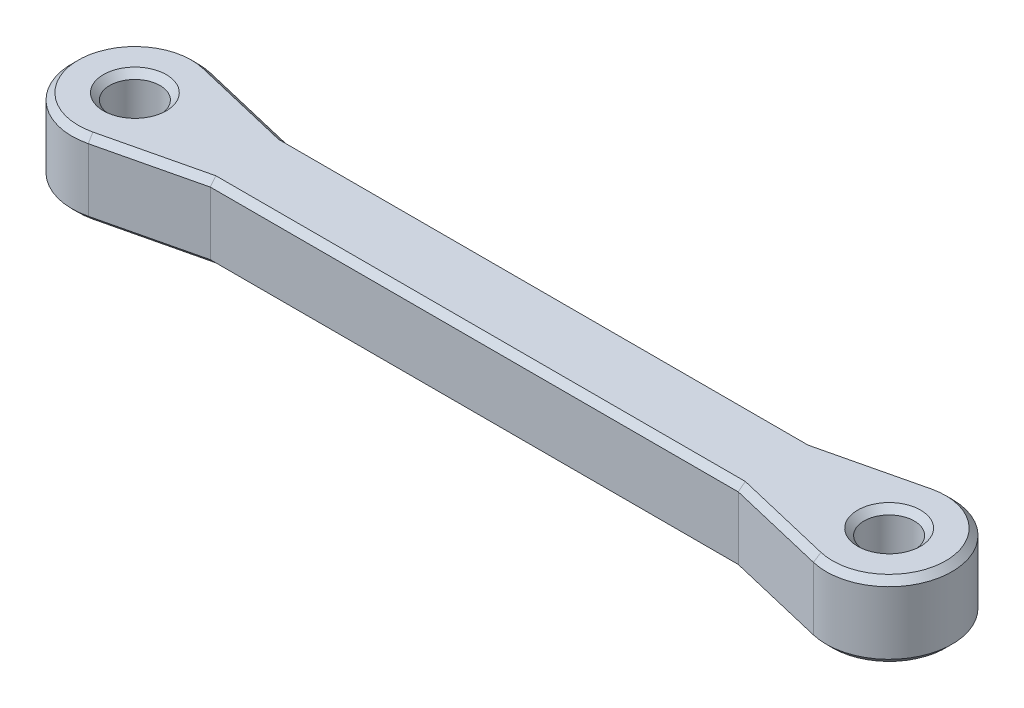
ISO-10303-21;
HEADER;
FILE_DESCRIPTION(('STEP AP214'),'2;1');
FILE_NAME('part.step','',(''),(''),'','','');
FILE_SCHEMA(('AUTOMOTIVE_DESIGN { 1 0 10303 214 1 1 1 1 }'));
ENDSEC;
DATA;
#1=APPLICATION_CONTEXT('core data for automotive mechanical design processes');
#2=APPLICATION_PROTOCOL_DEFINITION('international standard','automotive_design',2000,#1);
#3=PRODUCT_CONTEXT('',#1,'mechanical');
#4=PRODUCT('Part','Part','',(#3));
#5=PRODUCT_RELATED_PRODUCT_CATEGORY('part','',(#4));
#6=PRODUCT_DEFINITION_FORMATION('','',#4);
#7=PRODUCT_DEFINITION_CONTEXT('part definition',#1,'design');
#8=PRODUCT_DEFINITION('design','',#6,#7);
#9=PRODUCT_DEFINITION_SHAPE('','',#8);
#10=(LENGTH_UNIT() NAMED_UNIT(*) SI_UNIT(.MILLI.,.METRE.));
#11=(NAMED_UNIT(*) PLANE_ANGLE_UNIT() SI_UNIT($,.RADIAN.));
#12=(NAMED_UNIT(*) SI_UNIT($,.STERADIAN.) SOLID_ANGLE_UNIT());
#13=UNCERTAINTY_MEASURE_WITH_UNIT(LENGTH_MEASURE(1.E-05),#10,'distance_accuracy_value','');
#14=(GEOMETRIC_REPRESENTATION_CONTEXT(3) GLOBAL_UNCERTAINTY_ASSIGNED_CONTEXT((#13)) GLOBAL_UNIT_ASSIGNED_CONTEXT((#10,
#11,#12)) REPRESENTATION_CONTEXT('',''));
#15=CARTESIAN_POINT('',(0.,0.,0.));
#16=DIRECTION('',(0.,0.,1.));
#17=DIRECTION('',(1.,0.,0.));
#18=AXIS2_PLACEMENT_3D('',#15,#16,#17);
#19=CARTESIAN_POINT('',(2.,3.,-1.5));
#20=DIRECTION('',(0.,0.,1.));
#21=DIRECTION('',(1.,0.,0.));
#22=AXIS2_PLACEMENT_3D('',#19,#20,#21);
#23=PLANE('',#22);
#24=DIRECTION('',(0.,-1.,0.));
#25=VECTOR('',#24,1.);
#26=CARTESIAN_POINT('',(25.5,7.03112887414928,-1.50000000000001));
#27=LINE('',#26,#25);
#28=CARTESIAN_POINT('',(25.5,2.75,-1.50000000000001));
#29=VERTEX_POINT('',#28);
#30=CARTESIAN_POINT('',(25.5,0.25,-1.50000000000001));
#31=VERTEX_POINT('',#30);
#32=EDGE_CURVE('E351',#29,#31,#27,.T.);
#33=ORIENTED_EDGE('',*,*,#32,.T.);
#34=DIRECTION('',(-1.,0.,0.));
#35=VECTOR('',#34,1.);
#36=CARTESIAN_POINT('',(2.,0.25,-1.5));
#37=LINE('',#36,#35);
#38=CARTESIAN_POINT('',(4.5,0.25,-1.5));
#39=VERTEX_POINT('',#38);
#40=EDGE_CURVE('E167',#31,#39,#37,.T.);
#41=ORIENTED_EDGE('',*,*,#40,.T.);
#42=DIRECTION('',(0.,-1.,0.));
#43=VECTOR('',#42,1.);
#44=CARTESIAN_POINT('',(4.5,7.03112887414928,-1.5));
#45=LINE('',#44,#43);
#46=CARTESIAN_POINT('',(4.5,2.75,-1.5));
#47=VERTEX_POINT('',#46);
#48=EDGE_CURVE('E310',#47,#39,#45,.T.);
#49=ORIENTED_EDGE('',*,*,#48,.F.);
#50=DIRECTION('',(1.,0.,0.));
#51=VECTOR('',#50,1.);
#52=CARTESIAN_POINT('',(25.5,2.75,-1.5));
#53=LINE('',#52,#51);
#54=EDGE_CURVE('E209',#47,#29,#53,.T.);
#55=ORIENTED_EDGE('',*,*,#54,.T.);
#56=EDGE_LOOP('',(#33,#41,#49,#55));
#57=FACE_BOUND('',#56,.T.);
#58=ADVANCED_FACE('F43',(#57),#23,.F.);
#59=CARTESIAN_POINT('',(30.,3.,0.));
#60=DIRECTION('',(0.,-1.,0.));
#61=DIRECTION('',(0.,0.,-1.));
#62=AXIS2_PLACEMENT_3D('',#59,#60,#61);
#63=CYLINDRICAL_SURFACE('',#62,2.5);
#64=DIRECTION('',(0.,-1.,0.));
#65=VECTOR('',#64,1.);
#66=CARTESIAN_POINT('',(29.4218548123582,7.03112887414928,2.43223110374131));
#67=LINE('',#66,#65);
#68=CARTESIAN_POINT('',(29.4218548123582,2.75,2.43223110374131));
#69=VERTEX_POINT('',#68);
#70=CARTESIAN_POINT('',(29.4218548123582,0.25,2.43223110374131));
#71=VERTEX_POINT('',#70);
#72=EDGE_CURVE('E347',#69,#71,#67,.T.);
#73=ORIENTED_EDGE('',*,*,#72,.T.);
#74=CARTESIAN_POINT('',(30.,0.25,0.));
#75=DIRECTION('',(0.,1.,0.));
#76=DIRECTION('',(0.,0.,1.));
#77=AXIS2_PLACEMENT_3D('',#74,#75,#76);
#78=CIRCLE('',#77,2.5);
#79=CARTESIAN_POINT('',(29.4218548123582,0.25,-2.43223110374131));
#80=VERTEX_POINT('',#79);
#81=EDGE_CURVE('E235',#71,#80,#78,.T.);
#82=ORIENTED_EDGE('',*,*,#81,.T.);
#83=DIRECTION('',(0.,-1.,0.));
#84=VECTOR('',#83,1.);
#85=CARTESIAN_POINT('',(29.4218548123582,7.03112887414928,-2.43223110374131));
#86=LINE('',#85,#84);
#87=CARTESIAN_POINT('',(29.4218548123582,2.75,-2.43223110374131));
#88=VERTEX_POINT('',#87);
#89=EDGE_CURVE('E273',#88,#80,#86,.T.);
#90=ORIENTED_EDGE('',*,*,#89,.F.);
#91=CARTESIAN_POINT('',(30.,2.75,0.));
#92=DIRECTION('',(0.,1.,0.));
#93=DIRECTION('',(0.,0.,1.));
#94=AXIS2_PLACEMENT_3D('',#91,#92,#93);
#95=CIRCLE('',#94,2.5);
#96=EDGE_CURVE('E233',#88,#69,#95,.F.);
#97=ORIENTED_EDGE('',*,*,#96,.T.);
#98=EDGE_LOOP('',(#73,#82,#90,#97));
#99=FACE_BOUND('',#98,.T.);
#100=ADVANCED_FACE('F414',(#99),#63,.T.);
#101=CARTESIAN_POINT('',(28.,3.,1.5));
#102=DIRECTION('',(0.,0.,-1.));
#103=DIRECTION('',(-1.,0.,0.));
#104=AXIS2_PLACEMENT_3D('',#101,#102,#103);
#105=PLANE('',#104);
#106=DIRECTION('',(0.,-1.,0.));
#107=VECTOR('',#106,1.);
#108=CARTESIAN_POINT('',(4.5,7.03112887414928,1.5));
#109=LINE('',#108,#107);
#110=CARTESIAN_POINT('',(4.5,2.75,1.5));
#111=VERTEX_POINT('',#110);
#112=CARTESIAN_POINT('',(4.5,0.25,1.5));
#113=VERTEX_POINT('',#112);
#114=EDGE_CURVE('E315',#111,#113,#109,.T.);
#115=ORIENTED_EDGE('',*,*,#114,.T.);
#116=DIRECTION('',(1.,0.,0.));
#117=VECTOR('',#116,1.);
#118=CARTESIAN_POINT('',(28.,0.25,1.5));
#119=LINE('',#118,#117);
#120=CARTESIAN_POINT('',(25.5,0.25,1.5));
#121=VERTEX_POINT('',#120);
#122=EDGE_CURVE('E226',#113,#121,#119,.T.);
#123=ORIENTED_EDGE('',*,*,#122,.T.);
#124=DIRECTION('',(0.,-1.,0.));
#125=VECTOR('',#124,1.);
#126=CARTESIAN_POINT('',(25.5,7.03112887414928,1.5));
#127=LINE('',#126,#125);
#128=CARTESIAN_POINT('',(25.5,2.75,1.5));
#129=VERTEX_POINT('',#128);
#130=EDGE_CURVE('E345',#129,#121,#127,.T.);
#131=ORIENTED_EDGE('',*,*,#130,.F.);
#132=DIRECTION('',(-1.,0.,0.));
#133=VECTOR('',#132,1.);
#134=CARTESIAN_POINT('',(4.5,2.75,1.5));
#135=LINE('',#134,#133);
#136=EDGE_CURVE('E224',#129,#111,#135,.T.);
#137=ORIENTED_EDGE('',*,*,#136,.T.);
#138=EDGE_LOOP('',(#115,#123,#131,#137));
#139=FACE_BOUND('',#138,.T.);
#140=ADVANCED_FACE('F381',(#139),#105,.F.);
#141=CARTESIAN_POINT('',(0.,3.,0.));
#142=DIRECTION('',(0.,-1.,0.));
#143=DIRECTION('',(0.,0.,-1.));
#144=AXIS2_PLACEMENT_3D('',#141,#142,#143);
#145=CYLINDRICAL_SURFACE('',#144,2.5);
#146=DIRECTION('',(0.,-1.,0.));
#147=VECTOR('',#146,1.);
#148=CARTESIAN_POINT('',(0.578145187641785,7.03112887414928,-2.4322311037413));
#149=LINE('',#148,#147);
#150=CARTESIAN_POINT('',(0.578145187641785,2.75,-2.4322311037413));
#151=VERTEX_POINT('',#150);
#152=CARTESIAN_POINT('',(0.578145187641785,0.25,-2.4322311037413));
#153=VERTEX_POINT('',#152);
#154=EDGE_CURVE('E181',#151,#153,#149,.T.);
#155=ORIENTED_EDGE('',*,*,#154,.T.);
#156=CARTESIAN_POINT('',(0.,0.25,0.));
#157=DIRECTION('',(0.,1.,0.));
#158=DIRECTION('',(0.,0.,1.));
#159=AXIS2_PLACEMENT_3D('',#156,#157,#158);
#160=CIRCLE('',#159,2.5);
#161=CARTESIAN_POINT('',(0.578145187641785,0.25,2.4322311037413));
#162=VERTEX_POINT('',#161);
#163=EDGE_CURVE('E218',#153,#162,#160,.T.);
#164=ORIENTED_EDGE('',*,*,#163,.T.);
#165=DIRECTION('',(0.,-1.,0.));
#166=VECTOR('',#165,1.);
#167=CARTESIAN_POINT('',(0.578145187641785,7.03112887414928,2.4322311037413));
#168=LINE('',#167,#166);
#169=CARTESIAN_POINT('',(0.578145187641785,2.75,2.4322311037413));
#170=VERTEX_POINT('',#169);
#171=EDGE_CURVE('E319',#170,#162,#168,.T.);
#172=ORIENTED_EDGE('',*,*,#171,.F.);
#173=CARTESIAN_POINT('',(0.,2.75,0.));
#174=DIRECTION('',(0.,1.,0.));
#175=DIRECTION('',(0.,0.,1.));
#176=AXIS2_PLACEMENT_3D('',#173,#174,#175);
#177=CIRCLE('',#176,2.5);
#178=EDGE_CURVE('E216',#170,#151,#177,.F.);
#179=ORIENTED_EDGE('',*,*,#178,.T.);
#180=EDGE_LOOP('',(#155,#164,#172,#179));
#181=FACE_BOUND('',#180,.T.);
#182=ADVANCED_FACE('F340',(#181),#145,.T.);
#183=CARTESIAN_POINT('',(0.,3.,0.));
#184=DIRECTION('',(0.,1.,0.));
#185=DIRECTION('',(0.,0.,1.));
#186=AXIS2_PLACEMENT_3D('',#183,#184,#185);
#187=PLANE('',#186);
#188=CARTESIAN_POINT('',(30.,3.,0.));
#189=DIRECTION('',(0.,1.,0.));
#190=DIRECTION('',(0.,0.,1.));
#191=AXIS2_PLACEMENT_3D('',#188,#189,#190);
#192=CIRCLE('',#191,1.25000000000001);
#193=CARTESIAN_POINT('',(30.,3.,1.25000000000001));
#194=VERTEX_POINT('',#193);
#195=EDGE_CURVE('E11',#194,#194,#192,.F.);
#196=ORIENTED_EDGE('',*,*,#195,.T.);
#197=EDGE_LOOP('',(#196));
#198=FACE_BOUND('',#197,.T.);
#199=CARTESIAN_POINT('',(0.,3.,0.));
#200=DIRECTION('',(0.,1.,0.));
#201=DIRECTION('',(0.,0.,1.));
#202=AXIS2_PLACEMENT_3D('',#199,#200,#201);
#203=CIRCLE('',#202,1.25000000000001);
#204=CARTESIAN_POINT('',(0.,3.,1.25000000000001));
#205=VERTEX_POINT('',#204);
#206=EDGE_CURVE('E53',#205,#205,#203,.F.);
#207=ORIENTED_EDGE('',*,*,#206,.T.);
#208=EDGE_LOOP('',(#207));
#209=FACE_BOUND('',#208,.T.);
#210=DIRECTION('',(1.,0.,0.));
#211=VECTOR('',#210,1.);
#212=CARTESIAN_POINT('',(25.5,3.,1.25));
#213=LINE('',#212,#211);
#214=CARTESIAN_POINT('',(4.47069555463433,3.,1.25));
#215=VERTEX_POINT('',#214);
#216=CARTESIAN_POINT('',(25.5293044453657,3.,1.25));
#217=VERTEX_POINT('',#216);
#218=EDGE_CURVE('E61',#215,#217,#213,.T.);
#219=ORIENTED_EDGE('',*,*,#218,.T.);
#220=DIRECTION('',(0.972892441496522,0.,0.231258075056715));
#221=VECTOR('',#220,1.);
#222=CARTESIAN_POINT('',(29.4796693311224,3.,2.18900799336718));
#223=LINE('',#222,#221);
#224=CARTESIAN_POINT('',(29.4796693311224,3.,2.18900799336717));
#225=VERTEX_POINT('',#224);
#226=EDGE_CURVE('E253',#217,#225,#223,.T.);
#227=ORIENTED_EDGE('',*,*,#226,.T.);
#228=CARTESIAN_POINT('',(30.,3.,0.));
#229=DIRECTION('',(0.,1.,0.));
#230=DIRECTION('',(0.,0.,1.));
#231=AXIS2_PLACEMENT_3D('',#228,#229,#230);
#232=CIRCLE('',#231,2.25);
#233=CARTESIAN_POINT('',(29.4796693311224,3.,-2.18900799336717));
#234=VERTEX_POINT('',#233);
#235=EDGE_CURVE('E241',#225,#234,#232,.T.);
#236=ORIENTED_EDGE('',*,*,#235,.T.);
#237=DIRECTION('',(-0.972892441496522,0.,0.231258075056714));
#238=VECTOR('',#237,1.);
#239=CARTESIAN_POINT('',(25.5578145187642,3.,-1.25677688962588));
#240=LINE('',#239,#238);
#241=CARTESIAN_POINT('',(25.5293044453656,3.,-1.25));
#242=VERTEX_POINT('',#241);
#243=EDGE_CURVE('E243',#234,#242,#240,.T.);
#244=ORIENTED_EDGE('',*,*,#243,.T.);
#245=DIRECTION('',(-1.,0.,0.));
#246=VECTOR('',#245,1.);
#247=CARTESIAN_POINT('',(4.5,3.,-1.25));
#248=LINE('',#247,#246);
#249=CARTESIAN_POINT('',(4.47069555463433,3.,-1.25));
#250=VERTEX_POINT('',#249);
#251=EDGE_CURVE('E245',#242,#250,#248,.T.);
#252=ORIENTED_EDGE('',*,*,#251,.T.);
#253=DIRECTION('',(-0.972892441496522,0.,-0.231258075056714));
#254=VECTOR('',#253,1.);
#255=CARTESIAN_POINT('',(0.520330668877606,3.,-2.18900799336717));
#256=LINE('',#255,#254);
#257=CARTESIAN_POINT('',(0.520330668877606,3.,-2.18900799336717));
#258=VERTEX_POINT('',#257);
#259=EDGE_CURVE('E247',#250,#258,#256,.T.);
#260=ORIENTED_EDGE('',*,*,#259,.T.);
#261=CARTESIAN_POINT('',(0.,3.,0.));
#262=DIRECTION('',(0.,1.,0.));
#263=DIRECTION('',(0.,0.,1.));
#264=AXIS2_PLACEMENT_3D('',#261,#262,#263);
#265=CIRCLE('',#264,2.25);
#266=CARTESIAN_POINT('',(0.520330668877607,3.,2.18900799336717));
#267=VERTEX_POINT('',#266);
#268=EDGE_CURVE('E249',#258,#267,#265,.T.);
#269=ORIENTED_EDGE('',*,*,#268,.T.);
#270=DIRECTION('',(0.972892441496522,0.,-0.231258075056714));
#271=VECTOR('',#270,1.);
#272=CARTESIAN_POINT('',(4.44218548123582,3.,1.25677688962587));
#273=LINE('',#272,#271);
#274=EDGE_CURVE('E66',#267,#215,#273,.T.);
#275=ORIENTED_EDGE('',*,*,#274,.T.);
#276=EDGE_LOOP('',(#219,#227,#236,#244,#252,#260,#269,#275));
#277=FACE_BOUND('',#276,.T.);
#278=ADVANCED_FACE('F399',(#198,#209,#277),#187,.T.);
#279=CARTESIAN_POINT('',(0.,0.,0.));
#280=DIRECTION('',(0.,1.,0.));
#281=DIRECTION('',(0.,0.,1.));
#282=AXIS2_PLACEMENT_3D('',#279,#280,#281);
#283=PLANE('',#282);
#284=CARTESIAN_POINT('',(30.,0.,0.));
#285=DIRECTION('',(0.,1.,0.));
#286=DIRECTION('',(0.,0.,1.));
#287=AXIS2_PLACEMENT_3D('',#284,#285,#286);
#288=CIRCLE('',#287,1.25);
#289=CARTESIAN_POINT('',(30.,0.,1.25));
#290=VERTEX_POINT('',#289);
#291=EDGE_CURVE('E189',#290,#290,#288,.T.);
#292=ORIENTED_EDGE('',*,*,#291,.T.);
#293=EDGE_LOOP('',(#292));
#294=FACE_BOUND('',#293,.T.);
#295=CARTESIAN_POINT('',(0.,0.,0.));
#296=DIRECTION('',(0.,1.,0.));
#297=DIRECTION('',(0.,0.,1.));
#298=AXIS2_PLACEMENT_3D('',#295,#296,#297);
#299=CIRCLE('',#298,1.25);
#300=CARTESIAN_POINT('',(0.,0.,1.25));
#301=VERTEX_POINT('',#300);
#302=EDGE_CURVE('E186',#301,#301,#299,.T.);
#303=ORIENTED_EDGE('',*,*,#302,.T.);
#304=EDGE_LOOP('',(#303));
#305=FACE_BOUND('',#304,.T.);
#306=DIRECTION('',(0.972892441496522,0.,0.231258075056714));
#307=VECTOR('',#306,1.);
#308=CARTESIAN_POINT('',(0.520330668877606,0.,-2.18900799336717));
#309=LINE('',#308,#307);
#310=CARTESIAN_POINT('',(0.520330668877607,0.,-2.18900799336717));
#311=VERTEX_POINT('',#310);
#312=CARTESIAN_POINT('',(4.47069555463433,0.,-1.25));
#313=VERTEX_POINT('',#312);
#314=EDGE_CURVE('E185',#311,#313,#309,.T.);
#315=ORIENTED_EDGE('',*,*,#314,.T.);
#316=DIRECTION('',(1.,0.,0.));
#317=VECTOR('',#316,1.);
#318=CARTESIAN_POINT('',(0.,0.,-1.25));
#319=LINE('',#318,#317);
#320=CARTESIAN_POINT('',(25.5293044453656,0.,-1.25));
#321=VERTEX_POINT('',#320);
#322=EDGE_CURVE('E164',#313,#321,#319,.T.);
#323=ORIENTED_EDGE('',*,*,#322,.T.);
#324=DIRECTION('',(0.972892441496522,0.,-0.231258075056714));
#325=VECTOR('',#324,1.);
#326=CARTESIAN_POINT('',(1.08407824949049,0.,4.56066900436418));
#327=LINE('',#326,#325);
#328=CARTESIAN_POINT('',(29.4796693311224,0.,-2.18900799336718));
#329=VERTEX_POINT('',#328);
#330=EDGE_CURVE('E174',#321,#329,#327,.T.);
#331=ORIENTED_EDGE('',*,*,#330,.T.);
#332=CARTESIAN_POINT('',(30.,0.,0.));
#333=DIRECTION('',(0.,1.,0.));
#334=DIRECTION('',(0.,0.,1.));
#335=AXIS2_PLACEMENT_3D('',#332,#333,#334);
#336=CIRCLE('',#335,2.25);
#337=CARTESIAN_POINT('',(29.4796693311224,0.,2.18900799336718));
#338=VERTEX_POINT('',#337);
#339=EDGE_CURVE('E180',#329,#338,#336,.F.);
#340=ORIENTED_EDGE('',*,*,#339,.T.);
#341=DIRECTION('',(-0.972892441496522,0.,-0.231258075056715));
#342=VECTOR('',#341,1.);
#343=CARTESIAN_POINT('',(1.08407824949051,0.,-4.56066900436422));
#344=LINE('',#343,#342);
#345=CARTESIAN_POINT('',(25.5293044453657,0.,1.25));
#346=VERTEX_POINT('',#345);
#347=EDGE_CURVE('E324',#338,#346,#344,.T.);
#348=ORIENTED_EDGE('',*,*,#347,.T.);
#349=DIRECTION('',(-1.,0.,0.));
#350=VECTOR('',#349,1.);
#351=CARTESIAN_POINT('',(0.,0.,1.25));
#352=LINE('',#351,#350);
#353=CARTESIAN_POINT('',(4.47069555463433,0.,1.25));
#354=VERTEX_POINT('',#353);
#355=EDGE_CURVE('E326',#346,#354,#352,.T.);
#356=ORIENTED_EDGE('',*,*,#355,.T.);
#357=DIRECTION('',(-0.972892441496522,0.,0.231258075056714));
#358=VECTOR('',#357,1.);
#359=CARTESIAN_POINT('',(0.520330668877607,0.,2.18900799336717));
#360=LINE('',#359,#358);
#361=CARTESIAN_POINT('',(0.520330668877607,0.,2.18900799336717));
#362=VERTEX_POINT('',#361);
#363=EDGE_CURVE('E328',#354,#362,#360,.T.);
#364=ORIENTED_EDGE('',*,*,#363,.T.);
#365=CARTESIAN_POINT('',(0.,0.,0.));
#366=DIRECTION('',(0.,1.,0.));
#367=DIRECTION('',(0.,0.,1.));
#368=AXIS2_PLACEMENT_3D('',#365,#366,#367);
#369=CIRCLE('',#368,2.25);
#370=EDGE_CURVE('E191',#362,#311,#369,.F.);
#371=ORIENTED_EDGE('',*,*,#370,.T.);
#372=EDGE_LOOP('',(#315,#323,#331,#340,#348,#356,#364,#371));
#373=FACE_BOUND('',#372,.T.);
#374=ADVANCED_FACE('F183',(#294,#305,#373),#283,.F.);
#375=CARTESIAN_POINT('',(30.,5.82842712474619,0.));
#376=DIRECTION('',(0.,-1.,0.));
#377=DIRECTION('',(0.,0.,-1.));
#378=AXIS2_PLACEMENT_3D('',#375,#376,#377);
#379=CYLINDRICAL_SURFACE('',#378,1.);
#380=CARTESIAN_POINT('',(30.,0.250000000000003,0.));
#381=DIRECTION('',(0.,1.,0.));
#382=DIRECTION('',(0.,0.,1.));
#383=AXIS2_PLACEMENT_3D('',#380,#381,#382);
#384=CIRCLE('',#383,1.);
#385=CARTESIAN_POINT('',(30.,0.250000000000003,1.));
#386=VERTEX_POINT('',#385);
#387=EDGE_CURVE('E200',#386,#386,#384,.F.);
#388=ORIENTED_EDGE('',*,*,#387,.T.);
#389=EDGE_LOOP('',(#388));
#390=FACE_BOUND('',#389,.T.);
#391=CARTESIAN_POINT('',(30.,2.74999999999999,0.));
#392=DIRECTION('',(0.,1.,0.));
#393=DIRECTION('',(0.,0.,1.));
#394=AXIS2_PLACEMENT_3D('',#391,#392,#393);
#395=CIRCLE('',#394,1.);
#396=CARTESIAN_POINT('',(30.,2.74999999999999,1.));
#397=VERTEX_POINT('',#396);
#398=EDGE_CURVE('E197',#397,#397,#395,.T.);
#399=ORIENTED_EDGE('',*,*,#398,.T.);
#400=EDGE_LOOP('',(#399));
#401=FACE_BOUND('',#400,.T.);
#402=ADVANCED_FACE('F407',(#390,#401),#379,.F.);
#403=CARTESIAN_POINT('',(0.,5.82842712474619,0.));
#404=DIRECTION('',(0.,-1.,0.));
#405=DIRECTION('',(0.,0.,-1.));
#406=AXIS2_PLACEMENT_3D('',#403,#404,#405);
#407=CYLINDRICAL_SURFACE('',#406,1.);
#408=CARTESIAN_POINT('',(0.,0.250000000000005,0.));
#409=DIRECTION('',(0.,1.,0.));
#410=DIRECTION('',(0.,0.,1.));
#411=AXIS2_PLACEMENT_3D('',#408,#409,#410);
#412=CIRCLE('',#411,1.);
#413=CARTESIAN_POINT('',(0.,0.250000000000005,1.));
#414=VERTEX_POINT('',#413);
#415=EDGE_CURVE('E206',#414,#414,#412,.F.);
#416=ORIENTED_EDGE('',*,*,#415,.T.);
#417=EDGE_LOOP('',(#416));
#418=FACE_BOUND('',#417,.T.);
#419=CARTESIAN_POINT('',(0.,2.74999999999999,0.));
#420=DIRECTION('',(0.,1.,0.));
#421=DIRECTION('',(0.,0.,1.));
#422=AXIS2_PLACEMENT_3D('',#419,#420,#421);
#423=CIRCLE('',#422,1.);
#424=CARTESIAN_POINT('',(0.,2.74999999999999,1.));
#425=VERTEX_POINT('',#424);
#426=EDGE_CURVE('E203',#425,#425,#423,.T.);
#427=ORIENTED_EDGE('',*,*,#426,.T.);
#428=EDGE_LOOP('',(#427));
#429=FACE_BOUND('',#428,.T.);
#430=ADVANCED_FACE('F606',(#418,#429),#407,.F.);
#431=CARTESIAN_POINT('',(4.5,7.03112887414928,-1.5));
#432=DIRECTION('',(-0.231258075056714,0.,0.972892441496522));
#433=DIRECTION('',(0.972892441496522,0.,0.231258075056714));
#434=AXIS2_PLACEMENT_3D('',#431,#432,#433);
#435=PLANE('',#434);
#436=ORIENTED_EDGE('',*,*,#48,.T.);
#437=DIRECTION('',(-0.972892441496522,0.,-0.231258075056714));
#438=VECTOR('',#437,1.);
#439=CARTESIAN_POINT('',(4.5,0.25,-1.5));
#440=LINE('',#439,#438);
#441=EDGE_CURVE('E214',#39,#153,#440,.T.);
#442=ORIENTED_EDGE('',*,*,#441,.T.);
#443=ORIENTED_EDGE('',*,*,#154,.F.);
#444=DIRECTION('',(0.972892441496522,0.,0.231258075056714));
#445=VECTOR('',#444,1.);
#446=CARTESIAN_POINT('',(4.5,2.75,-1.5));
#447=LINE('',#446,#445);
#448=EDGE_CURVE('E212',#151,#47,#447,.T.);
#449=ORIENTED_EDGE('',*,*,#448,.T.);
#450=EDGE_LOOP('',(#436,#442,#443,#449));
#451=FACE_BOUND('',#450,.T.);
#452=ADVANCED_FACE('F309',(#451),#435,.F.);
#453=CARTESIAN_POINT('',(4.5,7.03112887414928,1.5));
#454=DIRECTION('',(-0.231258075056714,0.,-0.972892441496522));
#455=DIRECTION('',(-0.972892441496522,0.,0.231258075056714));
#456=AXIS2_PLACEMENT_3D('',#453,#454,#455);
#457=PLANE('',#456);
#458=ORIENTED_EDGE('',*,*,#171,.T.);
#459=DIRECTION('',(0.972892441496522,0.,-0.231258075056714));
#460=VECTOR('',#459,1.);
#461=CARTESIAN_POINT('',(4.5,0.25,1.5));
#462=LINE('',#461,#460);
#463=EDGE_CURVE('E222',#162,#113,#462,.T.);
#464=ORIENTED_EDGE('',*,*,#463,.T.);
#465=ORIENTED_EDGE('',*,*,#114,.F.);
#466=DIRECTION('',(-0.972892441496522,0.,0.231258075056714));
#467=VECTOR('',#466,1.);
#468=CARTESIAN_POINT('',(0.578145187641785,2.75,2.4322311037413));
#469=LINE('',#468,#467);
#470=EDGE_CURVE('E220',#111,#170,#469,.T.);
#471=ORIENTED_EDGE('',*,*,#470,.T.);
#472=EDGE_LOOP('',(#458,#464,#465,#471));
#473=FACE_BOUND('',#472,.T.);
#474=ADVANCED_FACE('F378',(#473),#457,.F.);
#475=CARTESIAN_POINT('',(25.5,7.03112887414928,1.5));
#476=DIRECTION('',(0.231258075056715,0.,-0.972892441496522));
#477=DIRECTION('',(-0.972892441496522,0.,-0.231258075056715));
#478=AXIS2_PLACEMENT_3D('',#475,#476,#477);
#479=PLANE('',#478);
#480=ORIENTED_EDGE('',*,*,#130,.T.);
#481=DIRECTION('',(0.972892441496522,0.,0.231258075056715));
#482=VECTOR('',#481,1.);
#483=CARTESIAN_POINT('',(25.5,0.25,1.5));
#484=LINE('',#483,#482);
#485=EDGE_CURVE('E231',#121,#71,#484,.T.);
#486=ORIENTED_EDGE('',*,*,#485,.T.);
#487=ORIENTED_EDGE('',*,*,#72,.F.);
#488=DIRECTION('',(-0.972892441496522,0.,-0.231258075056715));
#489=VECTOR('',#488,1.);
#490=CARTESIAN_POINT('',(25.5,2.75,1.50000000000001));
#491=LINE('',#490,#489);
#492=EDGE_CURVE('E228',#69,#129,#491,.T.);
#493=ORIENTED_EDGE('',*,*,#492,.T.);
#494=EDGE_LOOP('',(#480,#486,#487,#493));
#495=FACE_BOUND('',#494,.T.);
#496=ADVANCED_FACE('F390',(#495),#479,.F.);
#497=CARTESIAN_POINT('',(25.5,7.03112887414928,-1.50000000000001));
#498=DIRECTION('',(0.231258075056714,0.,0.972892441496522));
#499=DIRECTION('',(0.972892441496522,0.,-0.231258075056714));
#500=AXIS2_PLACEMENT_3D('',#497,#498,#499);
#501=PLANE('',#500);
#502=ORIENTED_EDGE('',*,*,#89,.T.);
#503=DIRECTION('',(-0.972892441496522,0.,0.231258075056714));
#504=VECTOR('',#503,1.);
#505=CARTESIAN_POINT('',(25.5,0.25,-1.50000000000001));
#506=LINE('',#505,#504);
#507=EDGE_CURVE('E239',#80,#31,#506,.T.);
#508=ORIENTED_EDGE('',*,*,#507,.T.);
#509=ORIENTED_EDGE('',*,*,#32,.F.);
#510=DIRECTION('',(0.972892441496522,0.,-0.231258075056714));
#511=VECTOR('',#510,1.);
#512=CARTESIAN_POINT('',(29.4218548123582,2.75,-2.43223110374131));
#513=LINE('',#512,#511);
#514=EDGE_CURVE('E237',#29,#88,#513,.T.);
#515=ORIENTED_EDGE('',*,*,#514,.T.);
#516=EDGE_LOOP('',(#502,#508,#509,#515));
#517=FACE_BOUND('',#516,.T.);
#518=ADVANCED_FACE('F357',(#517),#501,.F.);
#519=CARTESIAN_POINT('',(30.,0.,0.));
#520=DIRECTION('',(0.,-1.,0.));
#521=DIRECTION('',(0.,0.,-1.));
#522=AXIS2_PLACEMENT_3D('',#519,#520,#521);
#523=CONICAL_SURFACE('',#522,1.25,0.785398163397449);
#524=ORIENTED_EDGE('',*,*,#387,.F.);
#525=EDGE_LOOP('',(#524));
#526=FACE_BOUND('',#525,.T.);
#527=ORIENTED_EDGE('',*,*,#291,.F.);
#528=EDGE_LOOP('',(#527));
#529=FACE_BOUND('',#528,.T.);
#530=ADVANCED_FACE('F424',(#526,#529),#523,.F.);
#531=CARTESIAN_POINT('',(0.,0.,0.));
#532=DIRECTION('',(0.,-1.,0.));
#533=DIRECTION('',(0.,0.,-1.));
#534=AXIS2_PLACEMENT_3D('',#531,#532,#533);
#535=CONICAL_SURFACE('',#534,1.25,0.785398163397448);
#536=ORIENTED_EDGE('',*,*,#415,.F.);
#537=EDGE_LOOP('',(#536));
#538=FACE_BOUND('',#537,.T.);
#539=ORIENTED_EDGE('',*,*,#302,.F.);
#540=EDGE_LOOP('',(#539));
#541=FACE_BOUND('',#540,.T.);
#542=ADVANCED_FACE('F430',(#538,#541),#535,.F.);
#543=CARTESIAN_POINT('',(28.,0.25,1.5));
#544=DIRECTION('',(0.,0.707106781186547,-0.707106781186548));
#545=DIRECTION('',(1.,0.,0.));
#546=AXIS2_PLACEMENT_3D('',#543,#544,#545);
#547=PLANE('',#546);
#548=DIRECTION('',(-0.0826022349545819,-0.704690311690358,-0.704690311690358));
#549=VECTOR('',#548,1.);
#550=CARTESIAN_POINT('',(4.5,0.25,1.5));
#551=LINE('',#550,#549);
#552=EDGE_CURVE('E267',#354,#113,#551,.F.);
#553=ORIENTED_EDGE('',*,*,#552,.F.);
#554=ORIENTED_EDGE('',*,*,#355,.F.);
#555=DIRECTION('',(0.0826022349545702,-0.704690311690359,-0.704690311690359));
#556=VECTOR('',#555,1.);
#557=CARTESIAN_POINT('',(25.5170578230487,0.104477513258859,1.35447751325886));
#558=LINE('',#557,#556);
#559=EDGE_CURVE('E270',#121,#346,#558,.T.);
#560=ORIENTED_EDGE('',*,*,#559,.F.);
#561=ORIENTED_EDGE('',*,*,#122,.F.);
#562=EDGE_LOOP('',(#553,#554,#560,#561));
#563=FACE_BOUND('',#562,.T.);
#564=ADVANCED_FACE('F374',(#563),#547,.F.);
#565=CARTESIAN_POINT('',(25.5,0.25,1.5));
#566=DIRECTION('',(0.163524153076751,0.707106781186545,-0.687938842747329));
#567=DIRECTION('',(0.972892441496522,0.,0.231258075056715));
#568=AXIS2_PLACEMENT_3D('',#565,#566,#567);
#569=PLANE('',#568);
#570=ORIENTED_EDGE('',*,*,#559,.T.);
#571=ORIENTED_EDGE('',*,*,#347,.F.);
#572=DIRECTION('',(0.163524153076747,-0.70710678118655,-0.687938842747325));
#573=VECTOR('',#572,1.);
#574=CARTESIAN_POINT('',(29.4218548123582,0.25,2.43223110374131));
#575=LINE('',#574,#573);
#576=EDGE_CURVE('E264',#71,#338,#575,.T.);
#577=ORIENTED_EDGE('',*,*,#576,.F.);
#578=ORIENTED_EDGE('',*,*,#485,.F.);
#579=EDGE_LOOP('',(#570,#571,#577,#578));
#580=FACE_BOUND('',#579,.T.);
#581=ADVANCED_FACE('F368',(#580),#569,.F.);
#582=CARTESIAN_POINT('',(4.5,0.25,1.5));
#583=DIRECTION('',(-0.16352415307675,0.707106781186547,-0.687938842747328));
#584=DIRECTION('',(0.972892441496522,0.,-0.231258075056714));
#585=AXIS2_PLACEMENT_3D('',#582,#583,#584);
#586=PLANE('',#585);
#587=ORIENTED_EDGE('',*,*,#552,.T.);
#588=ORIENTED_EDGE('',*,*,#463,.F.);
#589=DIRECTION('',(0.16352415307675,0.707106781186548,0.687938842747327));
#590=VECTOR('',#589,1.);
#591=CARTESIAN_POINT('',(0.520330668877607,0.,2.18900799336717));
#592=LINE('',#591,#590);
#593=EDGE_CURVE('E261',#362,#162,#592,.T.);
#594=ORIENTED_EDGE('',*,*,#593,.F.);
#595=ORIENTED_EDGE('',*,*,#363,.F.);
#596=EDGE_LOOP('',(#587,#588,#594,#595));
#597=FACE_BOUND('',#596,.T.);
#598=ADVANCED_FACE('F376',(#597),#586,.F.);
#599=CARTESIAN_POINT('',(30.,0.25,0.));
#600=DIRECTION('',(0.,1.,0.));
#601=DIRECTION('',(0.,0.,1.));
#602=AXIS2_PLACEMENT_3D('',#599,#600,#601);
#603=CONICAL_SURFACE('',#602,2.5,0.785398163397447);
#604=ORIENTED_EDGE('',*,*,#576,.T.);
#605=ORIENTED_EDGE('',*,*,#339,.F.);
#606=DIRECTION('',(0.163524153076746,-0.707106781186548,0.687938842747328));
#607=VECTOR('',#606,1.);
#608=CARTESIAN_POINT('',(29.4218548123582,0.25,-2.43223110374131));
#609=LINE('',#608,#607);
#610=EDGE_CURVE('E177',#80,#329,#609,.T.);
#611=ORIENTED_EDGE('',*,*,#610,.F.);
#612=ORIENTED_EDGE('',*,*,#81,.F.);
#613=EDGE_LOOP('',(#604,#605,#611,#612));
#614=FACE_BOUND('',#613,.T.);
#615=ADVANCED_FACE('F363',(#614),#603,.T.);
#616=CARTESIAN_POINT('',(0.,0.25,0.));
#617=DIRECTION('',(0.,1.,0.));
#618=DIRECTION('',(0.,0.,1.));
#619=AXIS2_PLACEMENT_3D('',#616,#617,#618);
#620=CONICAL_SURFACE('',#619,2.5,0.785398163397447);
#621=ORIENTED_EDGE('',*,*,#593,.T.);
#622=ORIENTED_EDGE('',*,*,#163,.F.);
#623=DIRECTION('',(0.16352415307675,0.707106781186549,-0.687938842747326));
#624=VECTOR('',#623,1.);
#625=CARTESIAN_POINT('',(0.520330668877607,0.,-2.18900799336717));
#626=LINE('',#625,#624);
#627=EDGE_CURVE('E170',#311,#153,#626,.T.);
#628=ORIENTED_EDGE('',*,*,#627,.F.);
#629=ORIENTED_EDGE('',*,*,#370,.F.);
#630=EDGE_LOOP('',(#621,#622,#628,#629));
#631=FACE_BOUND('',#630,.T.);
#632=ADVANCED_FACE('F335',(#631),#620,.T.);
#633=CARTESIAN_POINT('',(25.5,0.25,-1.50000000000001));
#634=DIRECTION('',(0.16352415307675,0.707106781186545,0.68793884274733));
#635=DIRECTION('',(-0.972892441496522,0.,0.231258075056714));
#636=AXIS2_PLACEMENT_3D('',#633,#634,#635);
#637=PLANE('',#636);
#638=ORIENTED_EDGE('',*,*,#610,.T.);
#639=ORIENTED_EDGE('',*,*,#330,.F.);
#640=DIRECTION('',(-0.0826022349545664,0.704690311690359,-0.704690311690359));
#641=VECTOR('',#640,1.);
#642=CARTESIAN_POINT('',(25.339656463342,1.61791137536666,-2.86791137536666));
#643=LINE('',#642,#641);
#644=EDGE_CURVE('E160',#31,#321,#643,.F.);
#645=ORIENTED_EDGE('',*,*,#644,.F.);
#646=ORIENTED_EDGE('',*,*,#507,.F.);
#647=EDGE_LOOP('',(#638,#639,#645,#646));
#648=FACE_BOUND('',#647,.T.);
#649=ADVANCED_FACE('F175',(#648),#637,.F.);
#650=CARTESIAN_POINT('',(4.5,0.25,-1.5));
#651=DIRECTION('',(-0.16352415307675,0.707106781186546,0.687938842747328));
#652=DIRECTION('',(-0.972892441496522,0.,-0.231258075056714));
#653=AXIS2_PLACEMENT_3D('',#650,#651,#652);
#654=PLANE('',#653);
#655=ORIENTED_EDGE('',*,*,#627,.T.);
#656=ORIENTED_EDGE('',*,*,#441,.F.);
#657=DIRECTION('',(-0.0826022349545779,-0.704690311690358,0.704690311690358));
#658=VECTOR('',#657,1.);
#659=CARTESIAN_POINT('',(4.48294217695127,0.104477513258846,-1.35447751325885));
#660=LINE('',#659,#658);
#661=EDGE_CURVE('E171',#313,#39,#660,.F.);
#662=ORIENTED_EDGE('',*,*,#661,.F.);
#663=ORIENTED_EDGE('',*,*,#314,.F.);
#664=EDGE_LOOP('',(#655,#656,#662,#663));
#665=FACE_BOUND('',#664,.T.);
#666=ADVANCED_FACE('F338',(#665),#654,.F.);
#667=CARTESIAN_POINT('',(2.,0.25,-1.5));
#668=DIRECTION('',(0.,0.707106781186548,0.707106781186547));
#669=DIRECTION('',(-1.,0.,0.));
#670=AXIS2_PLACEMENT_3D('',#667,#668,#669);
#671=PLANE('',#670);
#672=ORIENTED_EDGE('',*,*,#644,.T.);
#673=ORIENTED_EDGE('',*,*,#322,.F.);
#674=ORIENTED_EDGE('',*,*,#661,.T.);
#675=ORIENTED_EDGE('',*,*,#40,.F.);
#676=EDGE_LOOP('',(#672,#673,#674,#675));
#677=FACE_BOUND('',#676,.T.);
#678=ADVANCED_FACE('F162',(#677),#671,.F.);
#679=CARTESIAN_POINT('',(30.,2.74999999999999,0.));
#680=DIRECTION('',(0.,1.,0.));
#681=DIRECTION('',(0.,0.,1.));
#682=AXIS2_PLACEMENT_3D('',#679,#680,#681);
#683=CONICAL_SURFACE('',#682,1.,0.785398163397449);
#684=ORIENTED_EDGE('',*,*,#195,.F.);
#685=EDGE_LOOP('',(#684));
#686=FACE_BOUND('',#685,.T.);
#687=ORIENTED_EDGE('',*,*,#398,.F.);
#688=EDGE_LOOP('',(#687));
#689=FACE_BOUND('',#688,.T.);
#690=ADVANCED_FACE('F445',(#686,#689),#683,.F.);
#691=CARTESIAN_POINT('',(0.,2.74999999999999,0.));
#692=DIRECTION('',(0.,1.,0.));
#693=DIRECTION('',(0.,0.,1.));
#694=AXIS2_PLACEMENT_3D('',#691,#692,#693);
#695=CONICAL_SURFACE('',#694,1.,0.785398163397448);
#696=ORIENTED_EDGE('',*,*,#206,.F.);
#697=EDGE_LOOP('',(#696));
#698=FACE_BOUND('',#697,.T.);
#699=ORIENTED_EDGE('',*,*,#426,.F.);
#700=EDGE_LOOP('',(#699));
#701=FACE_BOUND('',#700,.T.);
#702=ADVANCED_FACE('F484',(#698,#701),#695,.F.);
#703=CARTESIAN_POINT('',(0.520330668877606,3.,-2.18900799336717));
#704=DIRECTION('',(0.16352415307675,0.707106781186546,-0.687938842747328));
#705=DIRECTION('',(0.972892441496522,0.,0.231258075056714));
#706=AXIS2_PLACEMENT_3D('',#703,#704,#705);
#707=PLANE('',#706);
#708=DIRECTION('',(-0.0826022349545877,0.704690311690359,0.704690311690357));
#709=VECTOR('',#708,1.);
#710=CARTESIAN_POINT('',(4.49840041586052,2.76364625843898,-1.48635374156102));
#711=LINE('',#710,#709);
#712=EDGE_CURVE('E289',#47,#250,#711,.T.);
#713=ORIENTED_EDGE('',*,*,#712,.F.);
#714=ORIENTED_EDGE('',*,*,#448,.F.);
#715=DIRECTION('',(0.16352415307675,-0.707106781186549,-0.687938842747326));
#716=VECTOR('',#715,1.);
#717=CARTESIAN_POINT('',(0.520330668877606,3.,-2.18900799336717));
#718=LINE('',#717,#716);
#719=EDGE_CURVE('E48',#258,#151,#718,.T.);
#720=ORIENTED_EDGE('',*,*,#719,.F.);
#721=ORIENTED_EDGE('',*,*,#259,.F.);
#722=EDGE_LOOP('',(#713,#714,#720,#721));
#723=FACE_BOUND('',#722,.T.);
#724=ADVANCED_FACE('F46',(#723),#707,.T.);
#725=CARTESIAN_POINT('',(0.,3.,0.));
#726=DIRECTION('',(0.,-1.,0.));
#727=DIRECTION('',(0.,0.,-1.));
#728=AXIS2_PLACEMENT_3D('',#725,#726,#727);
#729=CONICAL_SURFACE('',#728,2.25,0.785398163397447);
#730=ORIENTED_EDGE('',*,*,#719,.T.);
#731=ORIENTED_EDGE('',*,*,#178,.F.);
#732=DIRECTION('',(0.16352415307675,-0.707106781186549,0.687938842747326));
#733=VECTOR('',#732,1.);
#734=CARTESIAN_POINT('',(0.520330668877607,3.,2.18900799336717));
#735=LINE('',#734,#733);
#736=EDGE_CURVE('E287',#267,#170,#735,.T.);
#737=ORIENTED_EDGE('',*,*,#736,.F.);
#738=ORIENTED_EDGE('',*,*,#268,.F.);
#739=EDGE_LOOP('',(#730,#731,#737,#738));
#740=FACE_BOUND('',#739,.T.);
#741=ADVANCED_FACE('F300',(#740),#729,.T.);
#742=CARTESIAN_POINT('',(0.,3.,-1.25));
#743=DIRECTION('',(0.,0.707106781186546,-0.707106781186549));
#744=DIRECTION('',(1.,0.,0.));
#745=AXIS2_PLACEMENT_3D('',#742,#743,#744);
#746=PLANE('',#745);
#747=ORIENTED_EDGE('',*,*,#712,.T.);
#748=ORIENTED_EDGE('',*,*,#251,.F.);
#749=DIRECTION('',(0.0826022349545771,0.70469031169036,0.704690311690357));
#750=VECTOR('',#749,1.);
#751=CARTESIAN_POINT('',(25.3551147022512,1.51396485293536,-2.73603514706463));
#752=LINE('',#751,#750);
#753=EDGE_CURVE('E284',#29,#242,#752,.T.);
#754=ORIENTED_EDGE('',*,*,#753,.F.);
#755=ORIENTED_EDGE('',*,*,#54,.F.);
#756=EDGE_LOOP('',(#747,#748,#754,#755));
#757=FACE_BOUND('',#756,.T.);
#758=ADVANCED_FACE('F520',(#757),#746,.T.);
#759=CARTESIAN_POINT('',(0.520330668877607,3.,2.18900799336717));
#760=DIRECTION('',(0.16352415307675,0.707106781186547,0.687938842747328));
#761=DIRECTION('',(-0.972892441496522,0.,0.231258075056714));
#762=AXIS2_PLACEMENT_3D('',#759,#760,#761);
#763=PLANE('',#762);
#764=ORIENTED_EDGE('',*,*,#736,.T.);
#765=ORIENTED_EDGE('',*,*,#470,.F.);
#766=DIRECTION('',(-0.0826022349545886,0.704690311690358,-0.704690311690357));
#767=VECTOR('',#766,1.);
#768=CARTESIAN_POINT('',(4.44019142116404,3.26023469382924,0.989765306170765));
#769=LINE('',#768,#767);
#770=EDGE_CURVE('E281',#215,#111,#769,.F.);
#771=ORIENTED_EDGE('',*,*,#770,.F.);
#772=ORIENTED_EDGE('',*,*,#274,.F.);
#773=EDGE_LOOP('',(#764,#765,#771,#772));
#774=FACE_BOUND('',#773,.T.);
#775=ADVANCED_FACE('F513',(#774),#763,.T.);
#776=CARTESIAN_POINT('',(1.08407824949049,3.,4.56066900436419));
#777=DIRECTION('',(-0.16352415307675,0.707106781186545,-0.68793884274733));
#778=DIRECTION('',(0.972892441496522,0.,-0.231258075056714));
#779=AXIS2_PLACEMENT_3D('',#776,#777,#778);
#780=PLANE('',#779);
#781=ORIENTED_EDGE('',*,*,#753,.T.);
#782=ORIENTED_EDGE('',*,*,#243,.F.);
#783=DIRECTION('',(0.163524153076746,0.70710678118655,0.687938842747326));
#784=VECTOR('',#783,1.);
#785=CARTESIAN_POINT('',(29.4218548123582,2.75,-2.43223110374131));
#786=LINE('',#785,#784);
#787=EDGE_CURVE('E278',#88,#234,#786,.T.);
#788=ORIENTED_EDGE('',*,*,#787,.F.);
#789=ORIENTED_EDGE('',*,*,#514,.F.);
#790=EDGE_LOOP('',(#781,#782,#788,#789));
#791=FACE_BOUND('',#790,.T.);
#792=ADVANCED_FACE('F507',(#791),#780,.T.);
#793=CARTESIAN_POINT('',(0.,3.,1.25));
#794=DIRECTION('',(0.,0.707106781186547,0.707106781186548));
#795=DIRECTION('',(-1.,0.,0.));
#796=AXIS2_PLACEMENT_3D('',#793,#794,#795);
#797=PLANE('',#796);
#798=ORIENTED_EDGE('',*,*,#770,.T.);
#799=ORIENTED_EDGE('',*,*,#136,.F.);
#800=DIRECTION('',(0.082602234954575,0.704690311690359,-0.704690311690358));
#801=VECTOR('',#800,1.);
#802=CARTESIAN_POINT('',(25.7007447094894,4.46257898745842,-0.212578987458419));
#803=LINE('',#802,#801);
#804=EDGE_CURVE('E276',#217,#129,#803,.F.);
#805=ORIENTED_EDGE('',*,*,#804,.F.);
#806=ORIENTED_EDGE('',*,*,#218,.F.);
#807=EDGE_LOOP('',(#798,#799,#805,#806));
#808=FACE_BOUND('',#807,.T.);
#809=ADVANCED_FACE('F385',(#808),#797,.T.);
#810=CARTESIAN_POINT('',(30.,3.,0.));
#811=DIRECTION('',(0.,-1.,0.));
#812=DIRECTION('',(0.,0.,-1.));
#813=AXIS2_PLACEMENT_3D('',#810,#811,#812);
#814=CONICAL_SURFACE('',#813,2.25,0.785398163397447);
#815=ORIENTED_EDGE('',*,*,#787,.T.);
#816=ORIENTED_EDGE('',*,*,#235,.F.);
#817=DIRECTION('',(0.163524153076746,0.707106781186549,-0.687938842747327));
#818=VECTOR('',#817,1.);
#819=CARTESIAN_POINT('',(29.4218548123582,2.75,2.43223110374131));
#820=LINE('',#819,#818);
#821=EDGE_CURVE('E274',#69,#225,#820,.T.);
#822=ORIENTED_EDGE('',*,*,#821,.F.);
#823=ORIENTED_EDGE('',*,*,#96,.F.);
#824=EDGE_LOOP('',(#815,#816,#822,#823));
#825=FACE_BOUND('',#824,.T.);
#826=ADVANCED_FACE('F397',(#825),#814,.T.);
#827=CARTESIAN_POINT('',(1.08407824949051,3.,-4.56066900436422));
#828=DIRECTION('',(-0.163524153076751,0.707106781186545,0.687938842747329));
#829=DIRECTION('',(-0.972892441496522,0.,-0.231258075056715));
#830=AXIS2_PLACEMENT_3D('',#827,#828,#829);
#831=PLANE('',#830);
#832=ORIENTED_EDGE('',*,*,#804,.T.);
#833=ORIENTED_EDGE('',*,*,#492,.F.);
#834=ORIENTED_EDGE('',*,*,#821,.T.);
#835=ORIENTED_EDGE('',*,*,#226,.F.);
#836=EDGE_LOOP('',(#832,#833,#834,#835));
#837=FACE_BOUND('',#836,.T.);
#838=ADVANCED_FACE('F393',(#837),#831,.T.);
#839=CLOSED_SHELL('',(#58,#100,#140,#182,#278,#374,#402,#430,#452,#474,#496,#518,#530,#542,#564,
#581,#598,#615,#632,#649,#666,#678,#690,#702,#724,#741,#758,#775,#792,#809,#826,#838));
#840=MANIFOLD_SOLID_BREP('B2',#839);
#841=ADVANCED_BREP_SHAPE_REPRESENTATION('',(#18,#840),#14);
#842=SHAPE_DEFINITION_REPRESENTATION(#9,#841);
ENDSEC;
END-ISO-10303-21;
